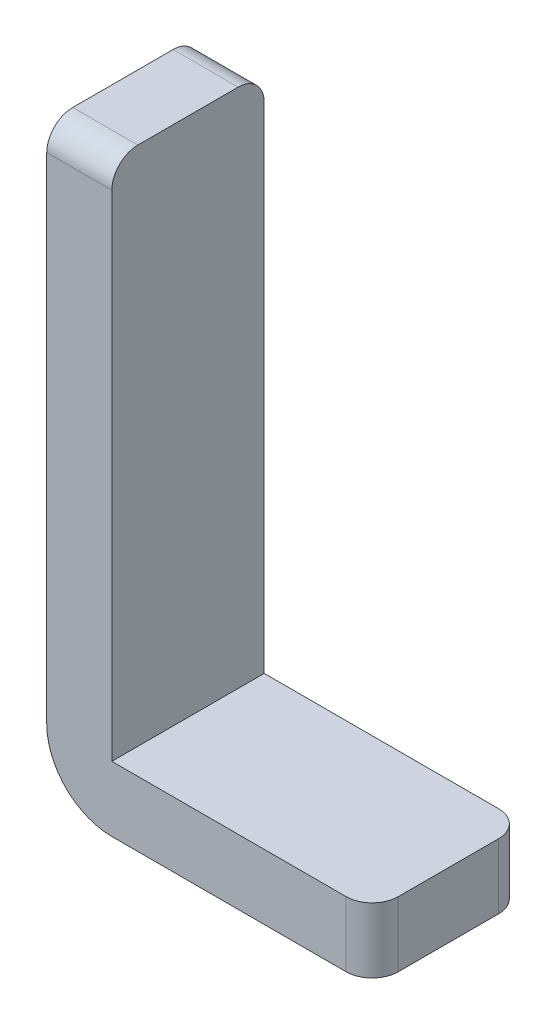
ISO-10303-21;
HEADER;
FILE_DESCRIPTION(('STEP AP214'),'2;1');
FILE_NAME('part.step','',(''),(''),'','','');
FILE_SCHEMA(('AUTOMOTIVE_DESIGN { 1 0 10303 214 1 1 1 1 }'));
ENDSEC;
DATA;
#1=APPLICATION_CONTEXT('core data for automotive mechanical design processes');
#2=APPLICATION_PROTOCOL_DEFINITION('international standard','automotive_design',2000,#1);
#3=PRODUCT_CONTEXT('',#1,'mechanical');
#4=PRODUCT('Part','Part','',(#3));
#5=PRODUCT_RELATED_PRODUCT_CATEGORY('part','',(#4));
#6=PRODUCT_DEFINITION_FORMATION('','',#4);
#7=PRODUCT_DEFINITION_CONTEXT('part definition',#1,'design');
#8=PRODUCT_DEFINITION('design','',#6,#7);
#9=PRODUCT_DEFINITION_SHAPE('','',#8);
#10=(LENGTH_UNIT() NAMED_UNIT(*) SI_UNIT(.MILLI.,.METRE.));
#11=(NAMED_UNIT(*) PLANE_ANGLE_UNIT() SI_UNIT($,.RADIAN.));
#12=(NAMED_UNIT(*) SI_UNIT($,.STERADIAN.) SOLID_ANGLE_UNIT());
#13=UNCERTAINTY_MEASURE_WITH_UNIT(LENGTH_MEASURE(1.E-05),#10,'distance_accuracy_value','');
#14=(GEOMETRIC_REPRESENTATION_CONTEXT(3) GLOBAL_UNCERTAINTY_ASSIGNED_CONTEXT((#13)) GLOBAL_UNIT_ASSIGNED_CONTEXT((#10,
#11,#12)) REPRESENTATION_CONTEXT('',''));
#15=CARTESIAN_POINT('',(0.,0.,0.));
#16=DIRECTION('',(0.,0.,1.));
#17=DIRECTION('',(1.,0.,0.));
#18=AXIS2_PLACEMENT_3D('',#15,#16,#17);
#19=CARTESIAN_POINT('',(0.,5.,-11.7041437493647));
#20=DIRECTION('',(1.,0.,0.));
#21=DIRECTION('',(0.,0.,-1.));
#22=AXIS2_PLACEMENT_3D('',#19,#20,#21);
#23=PLANE('',#22);
#24=DIRECTION('',(0.,-1.,0.));
#25=VECTOR('',#24,1.);
#26=CARTESIAN_POINT('',(0.,5.,0.));
#27=LINE('',#26,#25);
#28=CARTESIAN_POINT('',(0.,43.,0.));
#29=VERTEX_POINT('',#28);
#30=CARTESIAN_POINT('',(0.,5.,0.));
#31=VERTEX_POINT('',#30);
#32=EDGE_CURVE('E161',#29,#31,#27,.T.);
#33=ORIENTED_EDGE('',*,*,#32,.F.);
#34=CARTESIAN_POINT('',(0.,43.,-2.));
#35=DIRECTION('',(1.,0.,0.));
#36=DIRECTION('',(0.,0.,-1.));
#37=AXIS2_PLACEMENT_3D('',#34,#35,#36);
#38=CIRCLE('',#37,2.);
#39=CARTESIAN_POINT('',(0.,45.,-2.));
#40=VERTEX_POINT('',#39);
#41=EDGE_CURVE('E190',#29,#40,#38,.F.);
#42=ORIENTED_EDGE('',*,*,#41,.T.);
#43=DIRECTION('',(0.,0.,1.));
#44=VECTOR('',#43,1.);
#45=CARTESIAN_POINT('',(0.,45.,0.));
#46=LINE('',#45,#44);
#47=CARTESIAN_POINT('',(0.,45.,-9.70414374936472));
#48=VERTEX_POINT('',#47);
#49=EDGE_CURVE('E143',#48,#40,#46,.T.);
#50=ORIENTED_EDGE('',*,*,#49,.F.);
#51=CARTESIAN_POINT('',(0.,43.,-9.70414374936472));
#52=DIRECTION('',(1.,0.,0.));
#53=DIRECTION('',(0.,0.,-1.));
#54=AXIS2_PLACEMENT_3D('',#51,#52,#53);
#55=CIRCLE('',#54,2.);
#56=CARTESIAN_POINT('',(0.,43.,-11.7041437493647));
#57=VERTEX_POINT('',#56);
#58=EDGE_CURVE('E188',#48,#57,#55,.F.);
#59=ORIENTED_EDGE('',*,*,#58,.T.);
#60=DIRECTION('',(0.,-1.,0.));
#61=VECTOR('',#60,1.);
#62=CARTESIAN_POINT('',(0.,5.,-11.7041437493647));
#63=LINE('',#62,#61);
#64=CARTESIAN_POINT('',(0.,5.,-11.7041437493647));
#65=VERTEX_POINT('',#64);
#66=EDGE_CURVE('E126',#57,#65,#63,.T.);
#67=ORIENTED_EDGE('',*,*,#66,.T.);
#68=DIRECTION('',(0.,0.,1.));
#69=VECTOR('',#68,1.);
#70=CARTESIAN_POINT('',(0.,5.,-11.7041437493647));
#71=LINE('',#70,#69);
#72=EDGE_CURVE('E163',#65,#31,#71,.T.);
#73=ORIENTED_EDGE('',*,*,#72,.T.);
#74=EDGE_LOOP('',(#33,#42,#50,#59,#67,#73));
#75=FACE_BOUND('',#74,.T.);
#76=ADVANCED_FACE('F34',(#75),#23,.F.);
#77=CARTESIAN_POINT('',(0.,5.,0.));
#78=DIRECTION('',(0.,0.,-1.));
#79=DIRECTION('',(-1.,0.,0.));
#80=AXIS2_PLACEMENT_3D('',#77,#78,#79);
#81=PLANE('',#80);
#82=DIRECTION('',(0.,-1.,0.));
#83=VECTOR('',#82,1.);
#84=CARTESIAN_POINT('',(5.,45.,0.));
#85=LINE('',#84,#83);
#86=CARTESIAN_POINT('',(5.,43.,0.));
#87=VERTEX_POINT('',#86);
#88=CARTESIAN_POINT('',(5.,5.,0.));
#89=VERTEX_POINT('',#88);
#90=EDGE_CURVE('E137',#87,#89,#85,.T.);
#91=ORIENTED_EDGE('',*,*,#90,.F.);
#92=DIRECTION('',(1.,0.,0.));
#93=VECTOR('',#92,1.);
#94=CARTESIAN_POINT('',(0.,43.,0.));
#95=LINE('',#94,#93);
#96=EDGE_CURVE('E186',#87,#29,#95,.F.);
#97=ORIENTED_EDGE('',*,*,#96,.T.);
#98=ORIENTED_EDGE('',*,*,#32,.T.);
#99=CARTESIAN_POINT('',(5.,5.,0.));
#100=DIRECTION('',(0.,0.,-1.));
#101=DIRECTION('',(-1.,0.,0.));
#102=AXIS2_PLACEMENT_3D('',#99,#100,#101);
#103=CIRCLE('',#102,5.);
#104=CARTESIAN_POINT('',(5.,0.,0.));
#105=VERTEX_POINT('',#104);
#106=EDGE_CURVE('E166',#31,#105,#103,.F.);
#107=ORIENTED_EDGE('',*,*,#106,.T.);
#108=DIRECTION('',(1.,0.,0.));
#109=VECTOR('',#108,1.);
#110=CARTESIAN_POINT('',(0.,0.,0.));
#111=LINE('',#110,#109);
#112=CARTESIAN_POINT('',(23.,0.,0.));
#113=VERTEX_POINT('',#112);
#114=EDGE_CURVE('E150',#105,#113,#111,.T.);
#115=ORIENTED_EDGE('',*,*,#114,.T.);
#116=DIRECTION('',(0.,-1.,0.));
#117=VECTOR('',#116,1.);
#118=CARTESIAN_POINT('',(23.,5.,0.));
#119=LINE('',#118,#117);
#120=CARTESIAN_POINT('',(23.,5.,0.));
#121=VERTEX_POINT('',#120);
#122=EDGE_CURVE('E184',#113,#121,#119,.F.);
#123=ORIENTED_EDGE('',*,*,#122,.T.);
#124=DIRECTION('',(1.,0.,0.));
#125=VECTOR('',#124,1.);
#126=CARTESIAN_POINT('',(0.,5.,0.));
#127=LINE('',#126,#125);
#128=EDGE_CURVE('E151',#89,#121,#127,.T.);
#129=ORIENTED_EDGE('',*,*,#128,.F.);
#130=EDGE_LOOP('',(#91,#97,#98,#107,#115,#123,#129));
#131=FACE_BOUND('',#130,.T.);
#132=ADVANCED_FACE('F233',(#131),#81,.F.);
#133=CARTESIAN_POINT('',(25.,5.,0.));
#134=DIRECTION('',(-1.,0.,0.));
#135=DIRECTION('',(0.,0.,1.));
#136=AXIS2_PLACEMENT_3D('',#133,#134,#135);
#137=PLANE('',#136);
#138=DIRECTION('',(0.,0.,-1.));
#139=VECTOR('',#138,1.);
#140=CARTESIAN_POINT('',(25.,0.,0.));
#141=LINE('',#140,#139);
#142=CARTESIAN_POINT('',(25.,0.,-2.));
#143=VERTEX_POINT('',#142);
#144=CARTESIAN_POINT('',(25.,0.,-9.70414374936472));
#145=VERTEX_POINT('',#144);
#146=EDGE_CURVE('E157',#143,#145,#141,.T.);
#147=ORIENTED_EDGE('',*,*,#146,.T.);
#148=DIRECTION('',(0.,-1.,0.));
#149=VECTOR('',#148,1.);
#150=CARTESIAN_POINT('',(25.,5.,-9.70414374936472));
#151=LINE('',#150,#149);
#152=CARTESIAN_POINT('',(25.,5.,-9.70414374936472));
#153=VERTEX_POINT('',#152);
#154=EDGE_CURVE('E49',#145,#153,#151,.F.);
#155=ORIENTED_EDGE('',*,*,#154,.T.);
#156=DIRECTION('',(0.,0.,-1.));
#157=VECTOR('',#156,1.);
#158=CARTESIAN_POINT('',(25.,5.,0.));
#159=LINE('',#158,#157);
#160=CARTESIAN_POINT('',(25.,5.,-2.));
#161=VERTEX_POINT('',#160);
#162=EDGE_CURVE('E127',#161,#153,#159,.T.);
#163=ORIENTED_EDGE('',*,*,#162,.F.);
#164=DIRECTION('',(0.,-1.,0.));
#165=VECTOR('',#164,1.);
#166=CARTESIAN_POINT('',(25.,5.,-2.));
#167=LINE('',#166,#165);
#168=EDGE_CURVE('E199',#161,#143,#167,.T.);
#169=ORIENTED_EDGE('',*,*,#168,.T.);
#170=EDGE_LOOP('',(#147,#155,#163,#169));
#171=FACE_BOUND('',#170,.T.);
#172=ADVANCED_FACE('F204',(#171),#137,.F.);
#173=CARTESIAN_POINT('',(0.,5.,-11.7041437493647));
#174=DIRECTION('',(0.,0.,1.));
#175=DIRECTION('',(1.,0.,0.));
#176=AXIS2_PLACEMENT_3D('',#173,#174,#175);
#177=PLANE('',#176);
#178=ORIENTED_EDGE('',*,*,#66,.F.);
#179=DIRECTION('',(-1.,0.,0.));
#180=VECTOR('',#179,1.);
#181=CARTESIAN_POINT('',(0.,43.,-11.7041437493647));
#182=LINE('',#181,#180);
#183=CARTESIAN_POINT('',(5.,43.,-11.7041437493647));
#184=VERTEX_POINT('',#183);
#185=EDGE_CURVE('E134',#57,#184,#182,.F.);
#186=ORIENTED_EDGE('',*,*,#185,.T.);
#187=DIRECTION('',(0.,-1.,0.));
#188=VECTOR('',#187,1.);
#189=CARTESIAN_POINT('',(5.,45.,-11.7041437493647));
#190=LINE('',#189,#188);
#191=CARTESIAN_POINT('',(5.,5.,-11.7041437493647));
#192=VERTEX_POINT('',#191);
#193=EDGE_CURVE('E130',#184,#192,#190,.T.);
#194=ORIENTED_EDGE('',*,*,#193,.T.);
#195=DIRECTION('',(-1.,0.,0.));
#196=VECTOR('',#195,1.);
#197=CARTESIAN_POINT('',(0.,5.,-11.7041437493647));
#198=LINE('',#197,#196);
#199=CARTESIAN_POINT('',(23.,5.,-11.7041437493647));
#200=VERTEX_POINT('',#199);
#201=EDGE_CURVE('E116',#200,#192,#198,.T.);
#202=ORIENTED_EDGE('',*,*,#201,.F.);
#203=DIRECTION('',(0.,-1.,0.));
#204=VECTOR('',#203,1.);
#205=CARTESIAN_POINT('',(23.,5.,-11.7041437493647));
#206=LINE('',#205,#204);
#207=CARTESIAN_POINT('',(23.,0.,-11.7041437493647));
#208=VERTEX_POINT('',#207);
#209=EDGE_CURVE('E192',#200,#208,#206,.T.);
#210=ORIENTED_EDGE('',*,*,#209,.T.);
#211=DIRECTION('',(-1.,0.,0.));
#212=VECTOR('',#211,1.);
#213=CARTESIAN_POINT('',(0.,0.,-11.7041437493647));
#214=LINE('',#213,#212);
#215=CARTESIAN_POINT('',(5.,0.,-11.7041437493647));
#216=VERTEX_POINT('',#215);
#217=EDGE_CURVE('E153',#208,#216,#214,.T.);
#218=ORIENTED_EDGE('',*,*,#217,.T.);
#219=CARTESIAN_POINT('',(5.,5.,-11.7041437493647));
#220=DIRECTION('',(0.,0.,1.));
#221=DIRECTION('',(1.,0.,0.));
#222=AXIS2_PLACEMENT_3D('',#219,#220,#221);
#223=CIRCLE('',#222,5.);
#224=EDGE_CURVE('E171',#216,#65,#223,.F.);
#225=ORIENTED_EDGE('',*,*,#224,.T.);
#226=EDGE_LOOP('',(#178,#186,#194,#202,#210,#218,#225));
#227=FACE_BOUND('',#226,.T.);
#228=ADVANCED_FACE('F132',(#227),#177,.F.);
#229=CARTESIAN_POINT('',(0.,5.,0.));
#230=DIRECTION('',(0.,1.,0.));
#231=DIRECTION('',(0.,0.,1.));
#232=AXIS2_PLACEMENT_3D('',#229,#230,#231);
#233=PLANE('',#232);
#234=ORIENTED_EDGE('',*,*,#162,.T.);
#235=CARTESIAN_POINT('',(23.,5.,-9.70414374936472));
#236=DIRECTION('',(0.,1.,0.));
#237=DIRECTION('',(0.,0.,1.));
#238=AXIS2_PLACEMENT_3D('',#235,#236,#237);
#239=CIRCLE('',#238,2.);
#240=EDGE_CURVE('E11',#153,#200,#239,.T.);
#241=ORIENTED_EDGE('',*,*,#240,.T.);
#242=ORIENTED_EDGE('',*,*,#201,.T.);
#243=DIRECTION('',(0.,0.,-1.));
#244=VECTOR('',#243,1.);
#245=CARTESIAN_POINT('',(5.,5.,-11.7041437493647));
#246=LINE('',#245,#244);
#247=EDGE_CURVE('E120',#89,#192,#246,.T.);
#248=ORIENTED_EDGE('',*,*,#247,.F.);
#249=ORIENTED_EDGE('',*,*,#128,.T.);
#250=CARTESIAN_POINT('',(23.,5.,-2.));
#251=DIRECTION('',(0.,1.,0.));
#252=DIRECTION('',(0.,0.,1.));
#253=AXIS2_PLACEMENT_3D('',#250,#251,#252);
#254=CIRCLE('',#253,2.);
#255=EDGE_CURVE('E42',#121,#161,#254,.T.);
#256=ORIENTED_EDGE('',*,*,#255,.T.);
#257=EDGE_LOOP('',(#234,#241,#242,#248,#249,#256));
#258=FACE_BOUND('',#257,.T.);
#259=ADVANCED_FACE('F118',(#258),#233,.T.);
#260=CARTESIAN_POINT('',(0.,0.,0.));
#261=DIRECTION('',(0.,1.,0.));
#262=DIRECTION('',(0.,0.,1.));
#263=AXIS2_PLACEMENT_3D('',#260,#261,#262);
#264=PLANE('',#263);
#265=ORIENTED_EDGE('',*,*,#217,.F.);
#266=CARTESIAN_POINT('',(23.,0.,-9.70414374936472));
#267=DIRECTION('',(0.,1.,0.));
#268=DIRECTION('',(0.,0.,1.));
#269=AXIS2_PLACEMENT_3D('',#266,#267,#268);
#270=CIRCLE('',#269,2.);
#271=EDGE_CURVE('E197',#208,#145,#270,.F.);
#272=ORIENTED_EDGE('',*,*,#271,.T.);
#273=ORIENTED_EDGE('',*,*,#146,.F.);
#274=CARTESIAN_POINT('',(23.,0.,-2.));
#275=DIRECTION('',(0.,1.,0.));
#276=DIRECTION('',(0.,0.,1.));
#277=AXIS2_PLACEMENT_3D('',#274,#275,#276);
#278=CIRCLE('',#277,2.);
#279=EDGE_CURVE('E195',#143,#113,#278,.F.);
#280=ORIENTED_EDGE('',*,*,#279,.T.);
#281=ORIENTED_EDGE('',*,*,#114,.F.);
#282=DIRECTION('',(0.,0.,1.));
#283=VECTOR('',#282,1.);
#284=CARTESIAN_POINT('',(5.,0.,0.));
#285=LINE('',#284,#283);
#286=EDGE_CURVE('E168',#105,#216,#285,.F.);
#287=ORIENTED_EDGE('',*,*,#286,.T.);
#288=EDGE_LOOP('',(#265,#272,#273,#280,#281,#287));
#289=FACE_BOUND('',#288,.T.);
#290=ADVANCED_FACE('F208',(#289),#264,.F.);
#291=CARTESIAN_POINT('',(5.,45.,-11.7041437493647));
#292=DIRECTION('',(-1.,0.,0.));
#293=DIRECTION('',(0.,0.,1.));
#294=AXIS2_PLACEMENT_3D('',#291,#292,#293);
#295=PLANE('',#294);
#296=DIRECTION('',(0.,0.,-1.));
#297=VECTOR('',#296,1.);
#298=CARTESIAN_POINT('',(5.,45.,-11.7041437493647));
#299=LINE('',#298,#297);
#300=CARTESIAN_POINT('',(5.,45.,-2.));
#301=VERTEX_POINT('',#300);
#302=CARTESIAN_POINT('',(5.,45.,-9.70414374936472));
#303=VERTEX_POINT('',#302);
#304=EDGE_CURVE('E138',#301,#303,#299,.T.);
#305=ORIENTED_EDGE('',*,*,#304,.F.);
#306=CARTESIAN_POINT('',(5.,43.,-2.));
#307=DIRECTION('',(-1.,0.,0.));
#308=DIRECTION('',(0.,0.,1.));
#309=AXIS2_PLACEMENT_3D('',#306,#307,#308);
#310=CIRCLE('',#309,2.);
#311=EDGE_CURVE('E182',#301,#87,#310,.F.);
#312=ORIENTED_EDGE('',*,*,#311,.T.);
#313=ORIENTED_EDGE('',*,*,#90,.T.);
#314=ORIENTED_EDGE('',*,*,#247,.T.);
#315=ORIENTED_EDGE('',*,*,#193,.F.);
#316=CARTESIAN_POINT('',(5.,43.,-9.70414374936472));
#317=DIRECTION('',(-1.,0.,0.));
#318=DIRECTION('',(0.,0.,1.));
#319=AXIS2_PLACEMENT_3D('',#316,#317,#318);
#320=CIRCLE('',#319,2.);
#321=EDGE_CURVE('E180',#184,#303,#320,.F.);
#322=ORIENTED_EDGE('',*,*,#321,.T.);
#323=EDGE_LOOP('',(#305,#312,#313,#314,#315,#322));
#324=FACE_BOUND('',#323,.T.);
#325=ADVANCED_FACE('F141',(#324),#295,.F.);
#326=CARTESIAN_POINT('',(0.,45.,0.));
#327=DIRECTION('',(0.,-1.,0.));
#328=DIRECTION('',(0.,0.,-1.));
#329=AXIS2_PLACEMENT_3D('',#326,#327,#328);
#330=PLANE('',#329);
#331=ORIENTED_EDGE('',*,*,#49,.T.);
#332=DIRECTION('',(1.,0.,0.));
#333=VECTOR('',#332,1.);
#334=CARTESIAN_POINT('',(0.,45.,-2.));
#335=LINE('',#334,#333);
#336=EDGE_CURVE('E177',#40,#301,#335,.T.);
#337=ORIENTED_EDGE('',*,*,#336,.T.);
#338=ORIENTED_EDGE('',*,*,#304,.T.);
#339=DIRECTION('',(-1.,0.,0.));
#340=VECTOR('',#339,1.);
#341=CARTESIAN_POINT('',(0.,45.,-9.70414374936472));
#342=LINE('',#341,#340);
#343=EDGE_CURVE('E174',#303,#48,#342,.T.);
#344=ORIENTED_EDGE('',*,*,#343,.T.);
#345=EDGE_LOOP('',(#331,#337,#338,#344));
#346=FACE_BOUND('',#345,.T.);
#347=ADVANCED_FACE('F227',(#346),#330,.F.);
#348=CARTESIAN_POINT('',(5.,5.,-11.7041437493647));
#349=DIRECTION('',(0.,0.,1.));
#350=DIRECTION('',(1.,0.,0.));
#351=AXIS2_PLACEMENT_3D('',#348,#349,#350);
#352=CYLINDRICAL_SURFACE('',#351,5.);
#353=ORIENTED_EDGE('',*,*,#224,.F.);
#354=ORIENTED_EDGE('',*,*,#286,.F.);
#355=ORIENTED_EDGE('',*,*,#106,.F.);
#356=ORIENTED_EDGE('',*,*,#72,.F.);
#357=EDGE_LOOP('',(#353,#354,#355,#356));
#358=FACE_BOUND('',#357,.T.);
#359=ADVANCED_FACE('F217',(#358),#352,.T.);
#360=CARTESIAN_POINT('',(0.,43.,-2.));
#361=DIRECTION('',(1.,0.,0.));
#362=DIRECTION('',(0.,0.,-1.));
#363=AXIS2_PLACEMENT_3D('',#360,#361,#362);
#364=CYLINDRICAL_SURFACE('',#363,2.);
#365=ORIENTED_EDGE('',*,*,#41,.F.);
#366=ORIENTED_EDGE('',*,*,#96,.F.);
#367=ORIENTED_EDGE('',*,*,#311,.F.);
#368=ORIENTED_EDGE('',*,*,#336,.F.);
#369=EDGE_LOOP('',(#365,#366,#367,#368));
#370=FACE_BOUND('',#369,.T.);
#371=ADVANCED_FACE('F230',(#370),#364,.T.);
#372=CARTESIAN_POINT('',(0.,43.,-9.70414374936472));
#373=DIRECTION('',(-1.,0.,0.));
#374=DIRECTION('',(0.,0.,1.));
#375=AXIS2_PLACEMENT_3D('',#372,#373,#374);
#376=CYLINDRICAL_SURFACE('',#375,2.);
#377=ORIENTED_EDGE('',*,*,#321,.F.);
#378=ORIENTED_EDGE('',*,*,#185,.F.);
#379=ORIENTED_EDGE('',*,*,#58,.F.);
#380=ORIENTED_EDGE('',*,*,#343,.F.);
#381=EDGE_LOOP('',(#377,#378,#379,#380));
#382=FACE_BOUND('',#381,.T.);
#383=ADVANCED_FACE('F223',(#382),#376,.T.);
#384=CARTESIAN_POINT('',(23.,5.,-9.70414374936472));
#385=DIRECTION('',(0.,-1.,0.));
#386=DIRECTION('',(0.,0.,-1.));
#387=AXIS2_PLACEMENT_3D('',#384,#385,#386);
#388=CYLINDRICAL_SURFACE('',#387,2.);
#389=ORIENTED_EDGE('',*,*,#240,.F.);
#390=ORIENTED_EDGE('',*,*,#154,.F.);
#391=ORIENTED_EDGE('',*,*,#271,.F.);
#392=ORIENTED_EDGE('',*,*,#209,.F.);
#393=EDGE_LOOP('',(#389,#390,#391,#392));
#394=FACE_BOUND('',#393,.T.);
#395=ADVANCED_FACE('F211',(#394),#388,.T.);
#396=CARTESIAN_POINT('',(23.,5.,-2.));
#397=DIRECTION('',(0.,-1.,0.));
#398=DIRECTION('',(0.,0.,-1.));
#399=AXIS2_PLACEMENT_3D('',#396,#397,#398);
#400=CYLINDRICAL_SURFACE('',#399,2.);
#401=ORIENTED_EDGE('',*,*,#255,.F.);
#402=ORIENTED_EDGE('',*,*,#122,.F.);
#403=ORIENTED_EDGE('',*,*,#279,.F.);
#404=ORIENTED_EDGE('',*,*,#168,.F.);
#405=EDGE_LOOP('',(#401,#402,#403,#404));
#406=FACE_BOUND('',#405,.T.);
#407=ADVANCED_FACE('F36',(#406),#400,.T.);
#408=CLOSED_SHELL('',(#76,#132,#172,#228,#259,#290,#325,#347,#359,#371,#383,#395,#407));
#409=MANIFOLD_SOLID_BREP('B2',#408);
#410=ADVANCED_BREP_SHAPE_REPRESENTATION('',(#18,#409),#14);
#411=SHAPE_DEFINITION_REPRESENTATION(#9,#410);
ENDSEC;
END-ISO-10303-21;
